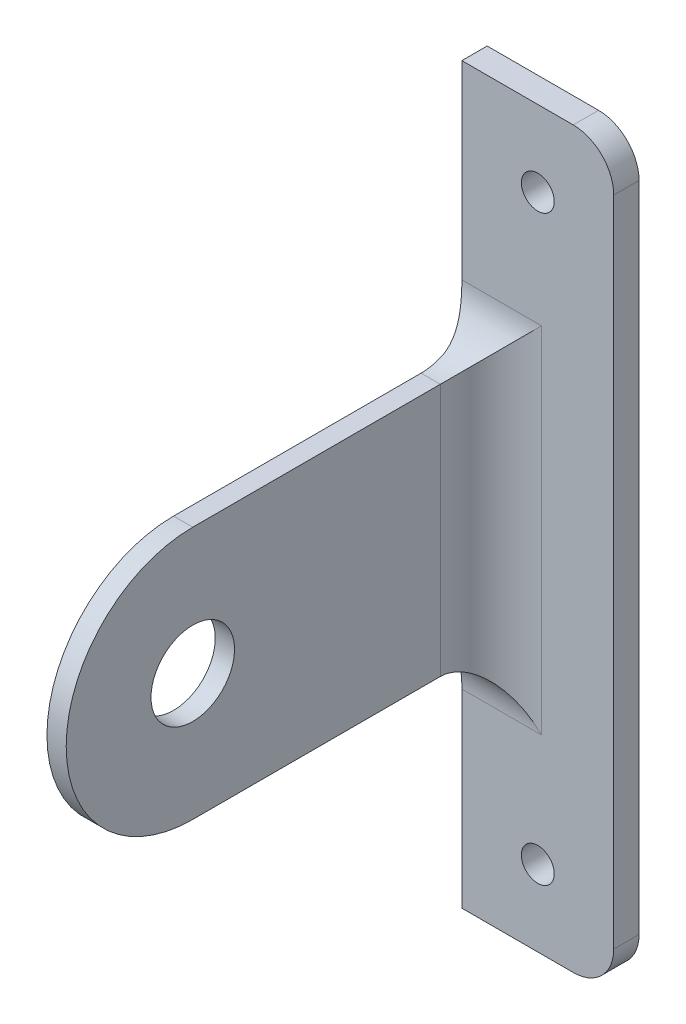
ISO-10303-21;
HEADER;
FILE_DESCRIPTION(('STEP AP214'),'2;1');
FILE_NAME('part.step','',(''),(''),'','','');
FILE_SCHEMA(('AUTOMOTIVE_DESIGN { 1 0 10303 214 1 1 1 1 }'));
ENDSEC;
DATA;
#1=APPLICATION_CONTEXT('core data for automotive mechanical design processes');
#2=APPLICATION_PROTOCOL_DEFINITION('international standard','automotive_design',2000,#1);
#3=PRODUCT_CONTEXT('',#1,'mechanical');
#4=PRODUCT('Part','Part','',(#3));
#5=PRODUCT_RELATED_PRODUCT_CATEGORY('part','',(#4));
#6=PRODUCT_DEFINITION_FORMATION('','',#4);
#7=PRODUCT_DEFINITION_CONTEXT('part definition',#1,'design');
#8=PRODUCT_DEFINITION('design','',#6,#7);
#9=PRODUCT_DEFINITION_SHAPE('','',#8);
#10=(LENGTH_UNIT() NAMED_UNIT(*) SI_UNIT(.MILLI.,.METRE.));
#11=(NAMED_UNIT(*) PLANE_ANGLE_UNIT() SI_UNIT($,.RADIAN.));
#12=(NAMED_UNIT(*) SI_UNIT($,.STERADIAN.) SOLID_ANGLE_UNIT());
#13=UNCERTAINTY_MEASURE_WITH_UNIT(LENGTH_MEASURE(1.E-05),#10,'distance_accuracy_value','');
#14=(GEOMETRIC_REPRESENTATION_CONTEXT(3) GLOBAL_UNCERTAINTY_ASSIGNED_CONTEXT((#13)) GLOBAL_UNIT_ASSIGNED_CONTEXT((#10,
#11,#12)) REPRESENTATION_CONTEXT('',''));
#15=CARTESIAN_POINT('',(0.,0.,0.));
#16=DIRECTION('',(0.,0.,1.));
#17=DIRECTION('',(1.,0.,0.));
#18=AXIS2_PLACEMENT_3D('',#15,#16,#17);
#19=CARTESIAN_POINT('',(0.,-12.5,0.));
#20=DIRECTION('',(0.,1.,0.));
#21=DIRECTION('',(0.,0.,1.));
#22=AXIS2_PLACEMENT_3D('',#19,#20,#21);
#23=PLANE('',#22);
#24=DIRECTION('',(0.,0.,1.));
#25=VECTOR('',#24,1.);
#26=CARTESIAN_POINT('',(0.,-12.5,-4.125));
#27=LINE('',#26,#25);
#28=CARTESIAN_POINT('',(0.,-12.5,-24.45));
#29=VERTEX_POINT('',#28);
#30=CARTESIAN_POINT('',(0.,-12.5,0.));
#31=VERTEX_POINT('',#30);
#32=EDGE_CURVE('E247',#29,#31,#27,.T.);
#33=ORIENTED_EDGE('',*,*,#32,.F.);
#34=DIRECTION('',(-1.,0.,0.));
#35=VECTOR('',#34,1.);
#36=CARTESIAN_POINT('',(1.90000000000001,-12.5,-24.45));
#37=LINE('',#36,#35);
#38=CARTESIAN_POINT('',(1.9,-12.5,-24.45));
#39=VERTEX_POINT('',#38);
#40=EDGE_CURVE('E265',#29,#39,#37,.F.);
#41=ORIENTED_EDGE('',*,*,#40,.T.);
#42=DIRECTION('',(0.,0.,-1.));
#43=VECTOR('',#42,1.);
#44=CARTESIAN_POINT('',(1.9,-12.5,-4.125));
#45=LINE('',#44,#43);
#46=CARTESIAN_POINT('',(1.9,-12.5,0.));
#47=VERTEX_POINT('',#46);
#48=EDGE_CURVE('E231',#47,#39,#45,.T.);
#49=ORIENTED_EDGE('',*,*,#48,.F.);
#50=DIRECTION('',(-1.,0.,0.));
#51=VECTOR('',#50,1.);
#52=CARTESIAN_POINT('',(1.9,-12.5,0.));
#53=LINE('',#52,#51);
#54=EDGE_CURVE('E218',#47,#31,#53,.T.);
#55=ORIENTED_EDGE('',*,*,#54,.T.);
#56=EDGE_LOOP('',(#33,#41,#49,#55));
#57=FACE_BOUND('',#56,.T.);
#58=ADVANCED_FACE('F43',(#57),#23,.F.);
#59=CARTESIAN_POINT('',(0.,12.5,0.));
#60=DIRECTION('',(0.,1.,0.));
#61=DIRECTION('',(0.,0.,1.));
#62=AXIS2_PLACEMENT_3D('',#59,#60,#61);
#63=PLANE('',#62);
#64=DIRECTION('',(0.,0.,-1.));
#65=VECTOR('',#64,1.);
#66=CARTESIAN_POINT('',(1.9,12.5,-4.125));
#67=LINE('',#66,#65);
#68=CARTESIAN_POINT('',(1.9,12.5,0.));
#69=VERTEX_POINT('',#68);
#70=CARTESIAN_POINT('',(1.9,12.5,-24.45));
#71=VERTEX_POINT('',#70);
#72=EDGE_CURVE('E242',#69,#71,#67,.T.);
#73=ORIENTED_EDGE('',*,*,#72,.T.);
#74=DIRECTION('',(-1.,0.,0.));
#75=VECTOR('',#74,1.);
#76=CARTESIAN_POINT('',(0.,12.5,-24.45));
#77=LINE('',#76,#75);
#78=CARTESIAN_POINT('',(0.,12.5,-24.45));
#79=VERTEX_POINT('',#78);
#80=EDGE_CURVE('E272',#71,#79,#77,.T.);
#81=ORIENTED_EDGE('',*,*,#80,.T.);
#82=DIRECTION('',(0.,0.,1.));
#83=VECTOR('',#82,1.);
#84=CARTESIAN_POINT('',(0.,12.5,-4.125));
#85=LINE('',#84,#83);
#86=CARTESIAN_POINT('',(0.,12.5,0.));
#87=VERTEX_POINT('',#86);
#88=EDGE_CURVE('E246',#79,#87,#85,.T.);
#89=ORIENTED_EDGE('',*,*,#88,.T.);
#90=DIRECTION('',(-1.,0.,0.));
#91=VECTOR('',#90,1.);
#92=CARTESIAN_POINT('',(1.9,12.5,0.));
#93=LINE('',#92,#91);
#94=EDGE_CURVE('E223',#69,#87,#93,.T.);
#95=ORIENTED_EDGE('',*,*,#94,.F.);
#96=EDGE_LOOP('',(#73,#81,#89,#95));
#97=FACE_BOUND('',#96,.T.);
#98=ADVANCED_FACE('F308',(#97),#63,.T.);
#99=CARTESIAN_POINT('',(1.9,12.5,-4.125));
#100=DIRECTION('',(-1.,0.,0.));
#101=DIRECTION('',(0.,0.,1.));
#102=AXIS2_PLACEMENT_3D('',#99,#100,#101);
#103=PLANE('',#102);
#104=CARTESIAN_POINT('',(1.9,0.,0.));
#105=DIRECTION('',(1.,0.,0.));
#106=DIRECTION('',(0.,0.,-1.));
#107=AXIS2_PLACEMENT_3D('',#104,#105,#106);
#108=CIRCLE('',#107,4.125);
#109=CARTESIAN_POINT('',(1.9,0.,4.125));
#110=VERTEX_POINT('',#109);
#111=EDGE_CURVE('E222',#110,#110,#108,.T.);
#112=ORIENTED_EDGE('',*,*,#111,.F.);
#113=EDGE_LOOP('',(#112));
#114=FACE_BOUND('',#113,.T.);
#115=ORIENTED_EDGE('',*,*,#48,.T.);
#116=DIRECTION('',(0.,-1.,0.));
#117=VECTOR('',#116,1.);
#118=CARTESIAN_POINT('',(1.9,12.5,-24.45));
#119=LINE('',#118,#117);
#120=EDGE_CURVE('E275',#39,#71,#119,.F.);
#121=ORIENTED_EDGE('',*,*,#120,.T.);
#122=ORIENTED_EDGE('',*,*,#72,.F.);
#123=CARTESIAN_POINT('',(1.9,0.,0.));
#124=DIRECTION('',(1.,0.,0.));
#125=DIRECTION('',(0.,0.,-1.));
#126=AXIS2_PLACEMENT_3D('',#123,#124,#125);
#127=CIRCLE('',#126,12.5);
#128=EDGE_CURVE('E232',#69,#47,#127,.T.);
#129=ORIENTED_EDGE('',*,*,#128,.T.);
#130=EDGE_LOOP('',(#115,#121,#122,#129));
#131=FACE_BOUND('',#130,.T.);
#132=ADVANCED_FACE('F298',(#114,#131),#103,.F.);
#133=CARTESIAN_POINT('',(0.,12.5,-4.125));
#134=DIRECTION('',(1.,0.,0.));
#135=DIRECTION('',(0.,0.,-1.));
#136=AXIS2_PLACEMENT_3D('',#133,#134,#135);
#137=PLANE('',#136);
#138=CARTESIAN_POINT('',(0.,0.,0.));
#139=DIRECTION('',(1.,0.,0.));
#140=DIRECTION('',(0.,0.,-1.));
#141=AXIS2_PLACEMENT_3D('',#138,#139,#140);
#142=CIRCLE('',#141,4.125);
#143=CARTESIAN_POINT('',(0.,0.,4.125));
#144=VERTEX_POINT('',#143);
#145=EDGE_CURVE('E227',#144,#144,#142,.T.);
#146=ORIENTED_EDGE('',*,*,#145,.T.);
#147=EDGE_LOOP('',(#146));
#148=FACE_BOUND('',#147,.T.);
#149=ORIENTED_EDGE('',*,*,#88,.F.);
#150=CARTESIAN_POINT('',(0.,17.5,-24.45));
#151=DIRECTION('',(1.,0.,0.));
#152=DIRECTION('',(0.,0.,-1.));
#153=AXIS2_PLACEMENT_3D('',#150,#151,#152);
#154=CIRCLE('',#153,5.);
#155=CARTESIAN_POINT('',(0.,12.9352791185284,-26.4904223274257));
#156=VERTEX_POINT('',#155);
#157=EDGE_CURVE('E11',#79,#156,#154,.T.);
#158=ORIENTED_EDGE('',*,*,#157,.T.);
#159=CARTESIAN_POINT('',(0.,12.9352791185284,-26.4904223274257));
#160=CARTESIAN_POINT('',(0.,12.5,-26.4904223274257));
#161=B_SPLINE_CURVE_WITH_KNOTS('',1,(#159,#160),.UNSPECIFIED.,.F.,.F.,(2,2),(0.,1.),.UNSPECIFIED.);
#162=CARTESIAN_POINT('',(0.,12.5,-26.4904223274257));
#163=VERTEX_POINT('',#162);
#164=EDGE_CURVE('E281',#156,#163,#161,.T.);
#165=ORIENTED_EDGE('',*,*,#164,.T.);
#166=DIRECTION('',(0.,-1.,0.));
#167=VECTOR('',#166,1.);
#168=CARTESIAN_POINT('',(0.,12.5,-26.4904223274257));
#169=LINE('',#168,#167);
#170=CARTESIAN_POINT('',(0.,-12.5,-26.4904223274257));
#171=VERTEX_POINT('',#170);
#172=EDGE_CURVE('E269',#163,#171,#169,.T.);
#173=ORIENTED_EDGE('',*,*,#172,.T.);
#174=CARTESIAN_POINT('',(0.,-12.5,-26.4904223274257));
#175=CARTESIAN_POINT('',(0.,-12.9352791185284,-26.4904223274257));
#176=B_SPLINE_CURVE_WITH_KNOTS('',1,(#174,#175),.UNSPECIFIED.,.F.,.F.,(2,2),(0.,1.),.UNSPECIFIED.);
#177=CARTESIAN_POINT('',(0.,-12.9352791185284,-26.4904223274257));
#178=VERTEX_POINT('',#177);
#179=EDGE_CURVE('E53',#171,#178,#176,.T.);
#180=ORIENTED_EDGE('',*,*,#179,.T.);
#181=CARTESIAN_POINT('',(0.,-17.5,-24.45));
#182=DIRECTION('',(1.,0.,0.));
#183=DIRECTION('',(0.,0.,-1.));
#184=AXIS2_PLACEMENT_3D('',#181,#182,#183);
#185=CIRCLE('',#184,5.);
#186=EDGE_CURVE('E278',#178,#29,#185,.T.);
#187=ORIENTED_EDGE('',*,*,#186,.T.);
#188=ORIENTED_EDGE('',*,*,#32,.T.);
#189=CARTESIAN_POINT('',(0.,0.,0.));
#190=DIRECTION('',(1.,0.,0.));
#191=DIRECTION('',(0.,0.,-1.));
#192=AXIS2_PLACEMENT_3D('',#189,#190,#191);
#193=CIRCLE('',#192,12.5);
#194=EDGE_CURVE('E217',#87,#31,#193,.T.);
#195=ORIENTED_EDGE('',*,*,#194,.F.);
#196=EDGE_LOOP('',(#149,#158,#165,#173,#180,#187,#188,#195));
#197=FACE_BOUND('',#196,.T.);
#198=ADVANCED_FACE('F287',(#148,#197),#137,.F.);
#199=CARTESIAN_POINT('',(1.9,12.5,-31.95));
#200=DIRECTION('',(0.,0.,1.));
#201=DIRECTION('',(1.,0.,0.));
#202=AXIS2_PLACEMENT_3D('',#199,#200,#201);
#203=PLANE('',#202);
#204=CARTESIAN_POINT('',(6.53,-28.75,-31.95));
#205=DIRECTION('',(0.,0.,1.));
#206=DIRECTION('',(-1.,0.,0.));
#207=AXIS2_PLACEMENT_3D('',#204,#205,#206);
#208=CIRCLE('',#207,1.625);
#209=CARTESIAN_POINT('',(4.905,-28.75,-31.95));
#210=VERTEX_POINT('',#209);
#211=EDGE_CURVE('E395',#210,#210,#208,.T.);
#212=ORIENTED_EDGE('',*,*,#211,.T.);
#213=EDGE_LOOP('',(#212));
#214=FACE_BOUND('',#213,.T.);
#215=CARTESIAN_POINT('',(6.53,28.75,-31.95));
#216=DIRECTION('',(0.,0.,-1.));
#217=DIRECTION('',(-1.,0.,0.));
#218=AXIS2_PLACEMENT_3D('',#215,#216,#217);
#219=CIRCLE('',#218,1.625);
#220=CARTESIAN_POINT('',(4.905,28.75,-31.95));
#221=VERTEX_POINT('',#220);
#222=EDGE_CURVE('E387',#221,#221,#219,.T.);
#223=ORIENTED_EDGE('',*,*,#222,.F.);
#224=EDGE_LOOP('',(#223));
#225=FACE_BOUND('',#224,.T.);
#226=DIRECTION('',(0.,-1.,0.));
#227=VECTOR('',#226,1.);
#228=CARTESIAN_POINT('',(14.03,12.5,-31.95));
#229=LINE('',#228,#227);
#230=CARTESIAN_POINT('',(14.03,32.25,-31.95));
#231=VERTEX_POINT('',#230);
#232=CARTESIAN_POINT('',(14.03,-32.25,-31.95));
#233=VERTEX_POINT('',#232);
#234=EDGE_CURVE('E214',#231,#233,#229,.T.);
#235=ORIENTED_EDGE('',*,*,#234,.T.);
#236=CARTESIAN_POINT('',(10.03,-32.25,-31.95));
#237=DIRECTION('',(0.,0.,1.));
#238=DIRECTION('',(-1.,0.,0.));
#239=AXIS2_PLACEMENT_3D('',#236,#237,#238);
#240=CIRCLE('',#239,4.);
#241=CARTESIAN_POINT('',(10.03,-36.25,-31.95));
#242=VERTEX_POINT('',#241);
#243=EDGE_CURVE('E171',#242,#233,#240,.T.);
#244=ORIENTED_EDGE('',*,*,#243,.F.);
#245=DIRECTION('',(1.,0.,0.));
#246=VECTOR('',#245,1.);
#247=CARTESIAN_POINT('',(-0.97,-36.25,-31.95));
#248=LINE('',#247,#246);
#249=CARTESIAN_POINT('',(-0.97,-36.25,-31.95));
#250=VERTEX_POINT('',#249);
#251=EDGE_CURVE('E166',#250,#242,#248,.T.);
#252=ORIENTED_EDGE('',*,*,#251,.F.);
#253=DIRECTION('',(0.,-1.,0.));
#254=VECTOR('',#253,1.);
#255=CARTESIAN_POINT('',(-0.97,12.5,-31.95));
#256=LINE('',#255,#254);
#257=CARTESIAN_POINT('',(-0.97,36.25,-31.95));
#258=VERTEX_POINT('',#257);
#259=EDGE_CURVE('E210',#258,#250,#256,.T.);
#260=ORIENTED_EDGE('',*,*,#259,.F.);
#261=DIRECTION('',(1.,0.,0.));
#262=VECTOR('',#261,1.);
#263=CARTESIAN_POINT('',(-0.97,36.25,-31.95));
#264=LINE('',#263,#262);
#265=CARTESIAN_POINT('',(10.03,36.25,-31.95));
#266=VERTEX_POINT('',#265);
#267=EDGE_CURVE('E191',#258,#266,#264,.T.);
#268=ORIENTED_EDGE('',*,*,#267,.T.);
#269=CARTESIAN_POINT('',(10.03,32.25,-31.95));
#270=DIRECTION('',(0.,0.,-1.));
#271=DIRECTION('',(-1.,0.,0.));
#272=AXIS2_PLACEMENT_3D('',#269,#270,#271);
#273=CIRCLE('',#272,4.);
#274=EDGE_CURVE('E187',#266,#231,#273,.T.);
#275=ORIENTED_EDGE('',*,*,#274,.T.);
#276=EDGE_LOOP('',(#235,#244,#252,#260,#268,#275));
#277=FACE_BOUND('',#276,.T.);
#278=ADVANCED_FACE('F297',(#214,#225,#277),#203,.F.);
#279=CARTESIAN_POINT('',(1.9,0.,0.));
#280=DIRECTION('',(-1.,0.,0.));
#281=DIRECTION('',(0.,0.,1.));
#282=AXIS2_PLACEMENT_3D('',#279,#280,#281);
#283=CYLINDRICAL_SURFACE('',#282,12.5);
#284=ORIENTED_EDGE('',*,*,#194,.T.);
#285=ORIENTED_EDGE('',*,*,#54,.F.);
#286=ORIENTED_EDGE('',*,*,#128,.F.);
#287=ORIENTED_EDGE('',*,*,#94,.T.);
#288=EDGE_LOOP('',(#284,#285,#286,#287));
#289=FACE_BOUND('',#288,.T.);
#290=ADVANCED_FACE('F304',(#289),#283,.T.);
#291=CARTESIAN_POINT('',(1.9,0.,0.));
#292=DIRECTION('',(-1.,0.,0.));
#293=DIRECTION('',(0.,0.,1.));
#294=AXIS2_PLACEMENT_3D('',#291,#292,#293);
#295=CYLINDRICAL_SURFACE('',#294,4.125);
#296=CARTESIAN_POINT('',(1.9,0.,4.125));
#297=CARTESIAN_POINT('',(1.88020833333333,0.,4.125));
#298=CARTESIAN_POINT('',(1.86041666666667,0.,4.125));
#299=CARTESIAN_POINT('',(1.82083333333333,0.,4.125));
#300=CARTESIAN_POINT('',(1.80104166666667,0.,4.125));
#301=CARTESIAN_POINT('',(1.76145833333333,0.,4.125));
#302=CARTESIAN_POINT('',(1.74166666666667,0.,4.125));
#303=CARTESIAN_POINT('',(1.70208333333333,0.,4.125));
#304=CARTESIAN_POINT('',(1.68229166666667,0.,4.125));
#305=CARTESIAN_POINT('',(1.64270833333333,0.,4.125));
#306=CARTESIAN_POINT('',(1.62291666666667,0.,4.125));
#307=CARTESIAN_POINT('',(1.58333333333333,0.,4.125));
#308=CARTESIAN_POINT('',(1.56354166666667,0.,4.125));
#309=CARTESIAN_POINT('',(1.52395833333333,0.,4.125));
#310=CARTESIAN_POINT('',(1.50416666666667,0.,4.125));
#311=CARTESIAN_POINT('',(1.46458333333333,0.,4.125));
#312=CARTESIAN_POINT('',(1.44479166666667,0.,4.125));
#313=CARTESIAN_POINT('',(1.40520833333333,0.,4.125));
#314=CARTESIAN_POINT('',(1.38541666666667,0.,4.125));
#315=CARTESIAN_POINT('',(1.34583333333333,0.,4.125));
#316=CARTESIAN_POINT('',(1.32604166666667,0.,4.125));
#317=CARTESIAN_POINT('',(1.28645833333333,0.,4.125));
#318=CARTESIAN_POINT('',(1.26666666666667,0.,4.125));
#319=CARTESIAN_POINT('',(1.22708333333333,0.,4.125));
#320=CARTESIAN_POINT('',(1.20729166666667,0.,4.125));
#321=CARTESIAN_POINT('',(1.16770833333333,0.,4.125));
#322=CARTESIAN_POINT('',(1.14791666666667,0.,4.125));
#323=CARTESIAN_POINT('',(1.10833333333333,0.,4.125));
#324=CARTESIAN_POINT('',(1.08854166666667,0.,4.125));
#325=CARTESIAN_POINT('',(1.04895833333333,0.,4.125));
#326=CARTESIAN_POINT('',(1.02916666666667,0.,4.125));
#327=CARTESIAN_POINT('',(0.989583333333333,0.,4.125));
#328=CARTESIAN_POINT('',(0.969791666666667,0.,4.125));
#329=CARTESIAN_POINT('',(0.930208333333333,0.,4.125));
#330=CARTESIAN_POINT('',(0.910416666666667,0.,4.125));
#331=CARTESIAN_POINT('',(0.870833333333333,0.,4.125));
#332=CARTESIAN_POINT('',(0.851041666666667,0.,4.125));
#333=CARTESIAN_POINT('',(0.811458333333333,0.,4.125));
#334=CARTESIAN_POINT('',(0.791666666666667,0.,4.125));
#335=CARTESIAN_POINT('',(0.752083333333333,0.,4.125));
#336=CARTESIAN_POINT('',(0.732291666666667,0.,4.125));
#337=CARTESIAN_POINT('',(0.692708333333333,0.,4.125));
#338=CARTESIAN_POINT('',(0.672916666666667,0.,4.125));
#339=CARTESIAN_POINT('',(0.633333333333333,0.,4.125));
#340=CARTESIAN_POINT('',(0.613541666666667,0.,4.125));
#341=CARTESIAN_POINT('',(0.573958333333333,0.,4.125));
#342=CARTESIAN_POINT('',(0.554166666666667,0.,4.125));
#343=CARTESIAN_POINT('',(0.514583333333333,0.,4.125));
#344=CARTESIAN_POINT('',(0.494791666666667,0.,4.125));
#345=CARTESIAN_POINT('',(0.455208333333333,0.,4.125));
#346=CARTESIAN_POINT('',(0.435416666666667,0.,4.125));
#347=CARTESIAN_POINT('',(0.395833333333333,0.,4.125));
#348=CARTESIAN_POINT('',(0.376041666666667,0.,4.125));
#349=CARTESIAN_POINT('',(0.336458333333333,0.,4.125));
#350=CARTESIAN_POINT('',(0.316666666666667,0.,4.125));
#351=CARTESIAN_POINT('',(0.277083333333333,0.,4.125));
#352=CARTESIAN_POINT('',(0.257291666666667,0.,4.125));
#353=CARTESIAN_POINT('',(0.217708333333333,0.,4.125));
#354=CARTESIAN_POINT('',(0.197916666666667,0.,4.125));
#355=CARTESIAN_POINT('',(0.158333333333333,0.,4.125));
#356=CARTESIAN_POINT('',(0.138541666666667,0.,4.125));
#357=CARTESIAN_POINT('',(0.0989583333333333,0.,4.125));
#358=CARTESIAN_POINT('',(0.0791666666666666,0.,4.125));
#359=CARTESIAN_POINT('',(0.0395833333333333,0.,4.125));
#360=CARTESIAN_POINT('',(0.0197916666666666,0.,4.125));
#361=CARTESIAN_POINT('',(0.,0.,4.125));
#362=B_SPLINE_CURVE_WITH_KNOTS('',3,(#296,#297,#298,#299,#300,#301,#302,#303,#304,#305,#306,
#307,#308,#309,#310,#311,#312,#313,#314,#315,#316,#317,#318,#319,#320,#321,#322,#323,#324,#325,
#326,#327,#328,#329,#330,#331,#332,#333,#334,#335,#336,#337,#338,#339,#340,#341,#342,#343,#344,
#345,#346,#347,#348,#349,#350,#351,#352,#353,#354,#355,#356,#357,#358,#359,#360,#361),
.UNSPECIFIED.,.F.,.F.,(4,2,2,2,2,2,2,2,2,2,2,2,2,2,2,2,2,2,2,2,2,2,2,2,2,2,2,2,2,2,2,2,4),(0.,
0.059375,0.11875,0.178125,0.2375,0.296875,0.35625,0.415625,0.475,0.534375,0.59375,0.653125,
0.7125,0.771875,0.83125,0.890625,0.95,1.009375,1.06875,1.128125,1.1875,1.246875,1.30625,
1.365625,1.425,1.484375,1.54375,1.603125,1.6625,1.721875,1.78125,1.840625,1.9),.UNSPECIFIED.);
#363=EDGE_CURVE('BSEAM440',#110,#144,#362,.T.);
#364=ORIENTED_EDGE('',*,*,#111,.T.);
#365=ORIENTED_EDGE('',*,*,#145,.F.);
#366=ORIENTED_EDGE('',*,*,#363,.T.);
#367=ORIENTED_EDGE('',*,*,#363,.F.);
#368=EDGE_LOOP('',(#364,#366,#365,#367));
#369=FACE_BOUND('',#368,.T.);
#370=ADVANCED_FACE('F440',(#369),#295,.F.);
#371=CARTESIAN_POINT('',(-0.97,12.5,-31.95));
#372=DIRECTION('',(1.,0.,0.));
#373=DIRECTION('',(0.,0.,-1.));
#374=AXIS2_PLACEMENT_3D('',#371,#372,#373);
#375=PLANE('',#374);
#376=ORIENTED_EDGE('',*,*,#259,.T.);
#377=DIRECTION('',(0.,0.,-1.));
#378=VECTOR('',#377,1.);
#379=CARTESIAN_POINT('',(-0.97,-36.25,-29.45));
#380=LINE('',#379,#378);
#381=CARTESIAN_POINT('',(-0.97,-36.25,-29.45));
#382=VERTEX_POINT('',#381);
#383=EDGE_CURVE('E177',#382,#250,#380,.T.);
#384=ORIENTED_EDGE('',*,*,#383,.F.);
#385=DIRECTION('',(0.,-1.,0.));
#386=VECTOR('',#385,1.);
#387=CARTESIAN_POINT('',(-0.97,12.5,-29.45));
#388=LINE('',#387,#386);
#389=CARTESIAN_POINT('',(-0.97,-17.5,-29.45));
#390=VERTEX_POINT('',#389);
#391=EDGE_CURVE('E155',#390,#382,#388,.T.);
#392=ORIENTED_EDGE('',*,*,#391,.F.);
#393=CARTESIAN_POINT('',(-0.97,17.5,-29.45));
#394=VERTEX_POINT('',#393);
#395=EDGE_CURVE('E211',#394,#390,#388,.T.);
#396=ORIENTED_EDGE('',*,*,#395,.F.);
#397=CARTESIAN_POINT('',(-0.97,36.25,-29.45));
#398=VERTEX_POINT('',#397);
#399=EDGE_CURVE('E206',#398,#394,#388,.T.);
#400=ORIENTED_EDGE('',*,*,#399,.F.);
#401=DIRECTION('',(0.,0.,-1.));
#402=VECTOR('',#401,1.);
#403=CARTESIAN_POINT('',(-0.97,36.25,-29.45));
#404=LINE('',#403,#402);
#405=EDGE_CURVE('E190',#398,#258,#404,.T.);
#406=ORIENTED_EDGE('',*,*,#405,.T.);
#407=EDGE_LOOP('',(#376,#384,#392,#396,#400,#406));
#408=FACE_BOUND('',#407,.T.);
#409=ADVANCED_FACE('F406',(#408),#375,.F.);
#410=CARTESIAN_POINT('',(14.03,12.5,-29.45));
#411=DIRECTION('',(0.,0.,-1.));
#412=DIRECTION('',(-1.,0.,0.));
#413=AXIS2_PLACEMENT_3D('',#410,#411,#412);
#414=PLANE('',#413);
#415=CARTESIAN_POINT('',(6.53,-28.75,-29.45));
#416=DIRECTION('',(0.,0.,1.));
#417=DIRECTION('',(-1.,0.,0.));
#418=AXIS2_PLACEMENT_3D('',#415,#416,#417);
#419=CIRCLE('',#418,1.625);
#420=CARTESIAN_POINT('',(4.905,-28.75,-29.45));
#421=VERTEX_POINT('',#420);
#422=EDGE_CURVE('E391',#421,#421,#419,.T.);
#423=ORIENTED_EDGE('',*,*,#422,.F.);
#424=EDGE_LOOP('',(#423));
#425=FACE_BOUND('',#424,.T.);
#426=CARTESIAN_POINT('',(6.53,28.75,-29.45));
#427=DIRECTION('',(0.,0.,-1.));
#428=DIRECTION('',(-1.,0.,0.));
#429=AXIS2_PLACEMENT_3D('',#426,#427,#428);
#430=CIRCLE('',#429,1.625);
#431=CARTESIAN_POINT('',(4.905,28.75,-29.45));
#432=VERTEX_POINT('',#431);
#433=EDGE_CURVE('E385',#432,#432,#430,.T.);
#434=ORIENTED_EDGE('',*,*,#433,.T.);
#435=EDGE_LOOP('',(#434));
#436=FACE_BOUND('',#435,.T.);
#437=DIRECTION('',(0.,-1.,0.));
#438=VECTOR('',#437,1.);
#439=CARTESIAN_POINT('',(6.9,-12.5,-29.45));
#440=LINE('',#439,#438);
#441=CARTESIAN_POINT('',(6.9,17.5,-29.45));
#442=VERTEX_POINT('',#441);
#443=CARTESIAN_POINT('',(6.9,-17.5,-29.45));
#444=VERTEX_POINT('',#443);
#445=EDGE_CURVE('E250',#442,#444,#440,.T.);
#446=ORIENTED_EDGE('',*,*,#445,.T.);
#447=DIRECTION('',(-1.,0.,0.));
#448=VECTOR('',#447,1.);
#449=CARTESIAN_POINT('',(0.,-17.5,-29.45));
#450=LINE('',#449,#448);
#451=EDGE_CURVE('E261',#444,#390,#450,.T.);
#452=ORIENTED_EDGE('',*,*,#451,.T.);
#453=ORIENTED_EDGE('',*,*,#391,.T.);
#454=DIRECTION('',(1.,0.,0.));
#455=VECTOR('',#454,1.);
#456=CARTESIAN_POINT('',(-0.97,-36.25,-29.45));
#457=LINE('',#456,#455);
#458=CARTESIAN_POINT('',(10.03,-36.25,-29.45));
#459=VERTEX_POINT('',#458);
#460=EDGE_CURVE('E161',#382,#459,#457,.T.);
#461=ORIENTED_EDGE('',*,*,#460,.T.);
#462=CARTESIAN_POINT('',(10.03,-32.25,-29.45));
#463=DIRECTION('',(0.,0.,1.));
#464=DIRECTION('',(-1.,0.,0.));
#465=AXIS2_PLACEMENT_3D('',#462,#463,#464);
#466=CIRCLE('',#465,4.);
#467=CARTESIAN_POINT('',(14.03,-32.25,-29.45));
#468=VERTEX_POINT('',#467);
#469=EDGE_CURVE('E158',#459,#468,#466,.T.);
#470=ORIENTED_EDGE('',*,*,#469,.T.);
#471=DIRECTION('',(0.,-1.,0.));
#472=VECTOR('',#471,1.);
#473=CARTESIAN_POINT('',(14.03,12.5,-29.45));
#474=LINE('',#473,#472);
#475=CARTESIAN_POINT('',(14.03,32.25,-29.45));
#476=VERTEX_POINT('',#475);
#477=EDGE_CURVE('E144',#476,#468,#474,.T.);
#478=ORIENTED_EDGE('',*,*,#477,.F.);
#479=CARTESIAN_POINT('',(10.03,32.25,-29.45));
#480=DIRECTION('',(0.,0.,-1.));
#481=DIRECTION('',(-1.,0.,0.));
#482=AXIS2_PLACEMENT_3D('',#479,#480,#481);
#483=CIRCLE('',#482,4.);
#484=CARTESIAN_POINT('',(10.03,36.25,-29.45));
#485=VERTEX_POINT('',#484);
#486=EDGE_CURVE('E186',#485,#476,#483,.T.);
#487=ORIENTED_EDGE('',*,*,#486,.F.);
#488=DIRECTION('',(1.,0.,0.));
#489=VECTOR('',#488,1.);
#490=CARTESIAN_POINT('',(-0.97,36.25,-29.45));
#491=LINE('',#490,#489);
#492=EDGE_CURVE('E182',#398,#485,#491,.T.);
#493=ORIENTED_EDGE('',*,*,#492,.F.);
#494=ORIENTED_EDGE('',*,*,#399,.T.);
#495=DIRECTION('',(-1.,0.,0.));
#496=VECTOR('',#495,1.);
#497=CARTESIAN_POINT('',(14.03,17.5,-29.45));
#498=LINE('',#497,#496);
#499=EDGE_CURVE('E258',#394,#442,#498,.F.);
#500=ORIENTED_EDGE('',*,*,#499,.T.);
#501=EDGE_LOOP('',(#446,#452,#453,#461,#470,#478,#487,#493,#494,#500));
#502=FACE_BOUND('',#501,.T.);
#503=ADVANCED_FACE('F159',(#425,#436,#502),#414,.F.);
#504=CARTESIAN_POINT('',(14.03,12.5,-31.95));
#505=DIRECTION('',(-1.,0.,0.));
#506=DIRECTION('',(0.,0.,1.));
#507=AXIS2_PLACEMENT_3D('',#504,#505,#506);
#508=PLANE('',#507);
#509=ORIENTED_EDGE('',*,*,#477,.T.);
#510=DIRECTION('',(0.,0.,-1.));
#511=VECTOR('',#510,1.);
#512=CARTESIAN_POINT('',(14.03,-32.25,-29.45));
#513=LINE('',#512,#511);
#514=EDGE_CURVE('E148',#468,#233,#513,.T.);
#515=ORIENTED_EDGE('',*,*,#514,.T.);
#516=ORIENTED_EDGE('',*,*,#234,.F.);
#517=DIRECTION('',(0.,0.,-1.));
#518=VECTOR('',#517,1.);
#519=CARTESIAN_POINT('',(14.03,32.25,-29.45));
#520=LINE('',#519,#518);
#521=EDGE_CURVE('E150',#476,#231,#520,.T.);
#522=ORIENTED_EDGE('',*,*,#521,.F.);
#523=EDGE_LOOP('',(#509,#515,#516,#522));
#524=FACE_BOUND('',#523,.T.);
#525=ADVANCED_FACE('F146',(#524),#508,.F.);
#526=CARTESIAN_POINT('',(10.03,32.25,-29.45));
#527=DIRECTION('',(0.,0.,-1.));
#528=DIRECTION('',(-1.,0.,0.));
#529=AXIS2_PLACEMENT_3D('',#526,#527,#528);
#530=CYLINDRICAL_SURFACE('',#529,4.);
#531=ORIENTED_EDGE('',*,*,#274,.F.);
#532=DIRECTION('',(0.,0.,-1.));
#533=VECTOR('',#532,1.);
#534=CARTESIAN_POINT('',(10.03,36.25,-29.45));
#535=LINE('',#534,#533);
#536=EDGE_CURVE('E200',#485,#266,#535,.T.);
#537=ORIENTED_EDGE('',*,*,#536,.F.);
#538=ORIENTED_EDGE('',*,*,#486,.T.);
#539=ORIENTED_EDGE('',*,*,#521,.T.);
#540=EDGE_LOOP('',(#531,#537,#538,#539));
#541=FACE_BOUND('',#540,.T.);
#542=ADVANCED_FACE('F418',(#541),#530,.T.);
#543=CARTESIAN_POINT('',(-0.97,36.25,-29.45));
#544=DIRECTION('',(0.,1.,0.));
#545=DIRECTION('',(0.,0.,1.));
#546=AXIS2_PLACEMENT_3D('',#543,#544,#545);
#547=PLANE('',#546);
#548=ORIENTED_EDGE('',*,*,#267,.F.);
#549=ORIENTED_EDGE('',*,*,#405,.F.);
#550=ORIENTED_EDGE('',*,*,#492,.T.);
#551=ORIENTED_EDGE('',*,*,#536,.T.);
#552=EDGE_LOOP('',(#548,#549,#550,#551));
#553=FACE_BOUND('',#552,.T.);
#554=ADVANCED_FACE('F423',(#553),#547,.T.);
#555=CARTESIAN_POINT('',(-0.97,-36.25,-29.45));
#556=DIRECTION('',(0.,1.,0.));
#557=DIRECTION('',(0.,0.,1.));
#558=AXIS2_PLACEMENT_3D('',#555,#556,#557);
#559=PLANE('',#558);
#560=ORIENTED_EDGE('',*,*,#251,.T.);
#561=DIRECTION('',(0.,0.,-1.));
#562=VECTOR('',#561,1.);
#563=CARTESIAN_POINT('',(10.03,-36.25,-29.45));
#564=LINE('',#563,#562);
#565=EDGE_CURVE('E173',#459,#242,#564,.T.);
#566=ORIENTED_EDGE('',*,*,#565,.F.);
#567=ORIENTED_EDGE('',*,*,#460,.F.);
#568=ORIENTED_EDGE('',*,*,#383,.T.);
#569=EDGE_LOOP('',(#560,#566,#567,#568));
#570=FACE_BOUND('',#569,.T.);
#571=ADVANCED_FACE('F426',(#570),#559,.F.);
#572=CARTESIAN_POINT('',(10.03,-32.25,-29.45));
#573=DIRECTION('',(0.,0.,-1.));
#574=DIRECTION('',(-1.,0.,0.));
#575=AXIS2_PLACEMENT_3D('',#572,#573,#574);
#576=CYLINDRICAL_SURFACE('',#575,4.);
#577=ORIENTED_EDGE('',*,*,#243,.T.);
#578=ORIENTED_EDGE('',*,*,#514,.F.);
#579=ORIENTED_EDGE('',*,*,#469,.F.);
#580=ORIENTED_EDGE('',*,*,#565,.T.);
#581=EDGE_LOOP('',(#577,#578,#579,#580));
#582=FACE_BOUND('',#581,.T.);
#583=ADVANCED_FACE('F169',(#582),#576,.T.);
#584=CARTESIAN_POINT('',(6.53,28.75,-29.45));
#585=DIRECTION('',(0.,0.,-1.));
#586=DIRECTION('',(-1.,0.,0.));
#587=AXIS2_PLACEMENT_3D('',#584,#585,#586);
#588=CYLINDRICAL_SURFACE('',#587,1.625);
#589=ORIENTED_EDGE('',*,*,#433,.F.);
#590=EDGE_LOOP('',(#589));
#591=FACE_BOUND('',#590,.T.);
#592=ORIENTED_EDGE('',*,*,#222,.T.);
#593=EDGE_LOOP('',(#592));
#594=FACE_BOUND('',#593,.T.);
#595=ADVANCED_FACE('F343',(#591,#594),#588,.F.);
#596=CARTESIAN_POINT('',(6.53,-28.75,-29.45));
#597=DIRECTION('',(0.,0.,-1.));
#598=DIRECTION('',(-1.,0.,0.));
#599=AXIS2_PLACEMENT_3D('',#596,#597,#598);
#600=CYLINDRICAL_SURFACE('',#599,1.625);
#601=ORIENTED_EDGE('',*,*,#422,.T.);
#602=EDGE_LOOP('',(#601));
#603=FACE_BOUND('',#602,.T.);
#604=ORIENTED_EDGE('',*,*,#211,.F.);
#605=EDGE_LOOP('',(#604));
#606=FACE_BOUND('',#605,.T.);
#607=ADVANCED_FACE('F336',(#603,#606),#600,.F.);
#608=CARTESIAN_POINT('',(0.,17.5,-24.45));
#609=DIRECTION('',(-1.,0.,0.));
#610=DIRECTION('',(0.,0.,1.));
#611=AXIS2_PLACEMENT_3D('',#608,#609,#610);
#612=CYLINDRICAL_SURFACE('',#611,5.);
#613=ORIENTED_EDGE('',*,*,#157,.F.);
#614=ORIENTED_EDGE('',*,*,#80,.F.);
#615=CARTESIAN_POINT('',(6.9,17.5,-24.45));
#616=DIRECTION('',(-0.707106781186547,0.707106781186547,0.));
#617=DIRECTION('',(0.707106781186547,0.707106781186547,0.));
#618=AXIS2_PLACEMENT_3D('',#615,#616,#617);
#619=ELLIPSE('',#618,7.07106781186547,5.);
#620=EDGE_CURVE('E47',#442,#71,#619,.T.);
#621=ORIENTED_EDGE('',*,*,#620,.F.);
#622=ORIENTED_EDGE('',*,*,#499,.F.);
#623=CARTESIAN_POINT('',(-0.97,17.5,-29.45));
#624=CARTESIAN_POINT('',(-0.970079899164056,17.3701049038207,-29.4500301365659));
#625=CARTESIAN_POINT('',(-0.966284576796977,17.2402500129345,-29.444939803141));
#626=CARTESIAN_POINT('',(-0.951551204793543,16.9818840424503,-29.4247605335802));
#627=CARTESIAN_POINT('',(-0.940622043722495,16.8533714925146,-29.409684039579));
#628=CARTESIAN_POINT('',(-0.912352046299374,16.5997565240031,-29.3699509679432));
#629=CARTESIAN_POINT('',(-0.895069028094303,16.4746339537154,-29.3453806810961));
#630=CARTESIAN_POINT('',(-0.855082497576353,16.2274269727635,-29.2870124477417));
#631=CARTESIAN_POINT('',(-0.832377482086573,16.105343415008,-29.2532119419049));
#632=CARTESIAN_POINT('',(-0.782816880609937,15.8654559815642,-29.1769477642139));
#633=CARTESIAN_POINT('',(-0.755981566245618,15.747634500377,-29.1345260958268));
#634=CARTESIAN_POINT('',(-0.699294757293463,15.516152033476,-29.0412870186986));
#635=CARTESIAN_POINT('',(-0.66944340943242,15.4024908457345,-28.9904700183051));
#636=CARTESIAN_POINT('',(-0.57696028922591,15.0675079823907,-28.8255122349336));
#637=CARTESIAN_POINT('',(-0.511559151953342,14.8528962193414,-28.6990922281402));
#638=CARTESIAN_POINT('',(-0.374301258983328,14.4173656935916,-28.3967087622663));
#639=CARTESIAN_POINT('',(-0.302726350453535,14.1993278789313,-28.2164166862097));
#640=CARTESIAN_POINT('',(-0.207238058290553,13.8961997256557,-27.9188054355513));
#641=CARTESIAN_POINT('',(-0.177418352421783,13.7992543282084,-27.8152232280683));
#642=CARTESIAN_POINT('',(-0.123261300433566,13.6139193241557,-27.5993808257014));
#643=CARTESIAN_POINT('',(-0.0989212666786567,13.5255255353961,-27.4871249214883));
#644=CARTESIAN_POINT('',(-0.0537066998880335,13.3435807966599,-27.234315876693));
#645=CARTESIAN_POINT('',(-0.0341646858240219,13.2517928573734,-27.092231038347));
#646=CARTESIAN_POINT('',(-0.0140201579687512,13.1248539090104,-26.8718450740968));
#647=CARTESIAN_POINT('',(-0.00883237271217802,13.0842682072443,-26.7970322882268));
#648=CARTESIAN_POINT('',(-0.00182011807073649,13.0068846804583,-26.6452626313622));
#649=CARTESIAN_POINT('',(2.25806700241875E-06,12.970089226354,-26.5683044561425));
#650=CARTESIAN_POINT('',(0.,12.9352791185284,-26.4904223274257));
#651=B_SPLINE_CURVE_WITH_KNOTS('',3,(#623,#624,#625,#626,#627,#628,#629,#630,#631,#632,#633,
#634,#635,#636,#637,#638,#639,#640,#641,#642,#643,#644,#645,#646,#647,#648,#649,#650),
.UNSPECIFIED.,.F.,.F.,(4,2,2,2,2,2,2,2,2,2,2,2,2,4),(0.,0.389466311164096,0.77844828202075,
1.16397487652975,1.54960847751762,1.93340642142806,2.31718570296248,3.08700618817996,
3.95804575551257,4.39245108998988,4.82664289359202,5.33611464761218,5.59177105585042,
5.84758642604938),.UNSPECIFIED.);
#652=EDGE_CURVE('E325',#156,#394,#651,.F.);
#653=ORIENTED_EDGE('',*,*,#652,.F.);
#654=EDGE_LOOP('',(#613,#614,#621,#622,#653));
#655=FACE_BOUND('',#654,.T.);
#656=ADVANCED_FACE('F333',(#655),#612,.F.);
#657=CARTESIAN_POINT('',(6.9,12.5,-24.45));
#658=DIRECTION('',(0.,1.,0.));
#659=DIRECTION('',(0.,0.,1.));
#660=AXIS2_PLACEMENT_3D('',#657,#658,#659);
#661=CYLINDRICAL_SURFACE('',#660,5.);
#662=ORIENTED_EDGE('',*,*,#620,.T.);
#663=ORIENTED_EDGE('',*,*,#120,.F.);
#664=CARTESIAN_POINT('',(6.9,-17.5,-24.45));
#665=DIRECTION('',(0.707106781186547,0.707106781186547,0.));
#666=DIRECTION('',(-0.707106781186547,0.707106781186547,0.));
#667=AXIS2_PLACEMENT_3D('',#664,#665,#666);
#668=ELLIPSE('',#667,7.07106781186547,5.);
#669=EDGE_CURVE('E332',#444,#39,#668,.T.);
#670=ORIENTED_EDGE('',*,*,#669,.F.);
#671=ORIENTED_EDGE('',*,*,#445,.F.);
#672=EDGE_LOOP('',(#662,#663,#670,#671));
#673=FACE_BOUND('',#672,.T.);
#674=ADVANCED_FACE('F45',(#673),#661,.F.);
#675=CARTESIAN_POINT('',(-5.,12.5,-26.4904223274257));
#676=DIRECTION('',(0.,-1.,0.));
#677=DIRECTION('',(0.,0.,-1.));
#678=AXIS2_PLACEMENT_3D('',#675,#676,#677);
#679=CYLINDRICAL_SURFACE('',#678,5.);
#680=ORIENTED_EDGE('',*,*,#652,.T.);
#681=ORIENTED_EDGE('',*,*,#395,.T.);
#682=CARTESIAN_POINT('',(-0.97,-17.5,-29.45));
#683=CARTESIAN_POINT('',(-0.970079899164056,-17.3701049038207,-29.4500301365659));
#684=CARTESIAN_POINT('',(-0.966284576796977,-17.2402500129345,-29.444939803141));
#685=CARTESIAN_POINT('',(-0.951551204793543,-16.9818840424503,-29.4247605335802));
#686=CARTESIAN_POINT('',(-0.940622043722495,-16.8533714925146,-29.409684039579));
#687=CARTESIAN_POINT('',(-0.912352046299374,-16.5997565240031,-29.3699509679432));
#688=CARTESIAN_POINT('',(-0.895069028094303,-16.4746339537154,-29.3453806810961));
#689=CARTESIAN_POINT('',(-0.855082497576353,-16.2274269727635,-29.2870124477417));
#690=CARTESIAN_POINT('',(-0.832377482086573,-16.105343415008,-29.2532119419049));
#691=CARTESIAN_POINT('',(-0.782816880609937,-15.8654559815642,-29.1769477642139));
#692=CARTESIAN_POINT('',(-0.755981566245618,-15.747634500377,-29.1345260958268));
#693=CARTESIAN_POINT('',(-0.699294757293463,-15.516152033476,-29.0412870186986));
#694=CARTESIAN_POINT('',(-0.66944340943242,-15.4024908457345,-28.9904700183051));
#695=CARTESIAN_POINT('',(-0.57696028922591,-15.0675079823907,-28.8255122349336));
#696=CARTESIAN_POINT('',(-0.511559151953341,-14.8528962193414,-28.6990922281402));
#697=CARTESIAN_POINT('',(-0.374301258983328,-14.4173656935916,-28.3967087622663));
#698=CARTESIAN_POINT('',(-0.302726350453535,-14.1993278789313,-28.2164166862097));
#699=CARTESIAN_POINT('',(-0.207238058290553,-13.8961997256557,-27.9188054355513));
#700=CARTESIAN_POINT('',(-0.177418352421783,-13.7992543282084,-27.8152232280683));
#701=CARTESIAN_POINT('',(-0.123261300433566,-13.6139193241557,-27.5993808257014));
#702=CARTESIAN_POINT('',(-0.0989212666786568,-13.5255255353961,-27.4871249214883));
#703=CARTESIAN_POINT('',(-0.0537066998880336,-13.3435807966599,-27.234315876693));
#704=CARTESIAN_POINT('',(-0.034164685824022,-13.2517928573734,-27.092231038347));
#705=CARTESIAN_POINT('',(-0.0140201579687513,-13.1248539090104,-26.8718450740968));
#706=CARTESIAN_POINT('',(-0.00883237271217809,-13.0842682072443,-26.7970322882268));
#707=CARTESIAN_POINT('',(-0.00182011807073658,-13.0068846804583,-26.6452626313622));
#708=CARTESIAN_POINT('',(2.25806700232282E-06,-12.970089226354,-26.5683044561425));
#709=CARTESIAN_POINT('',(0.,-12.9352791185284,-26.4904223274257));
#710=B_SPLINE_CURVE_WITH_KNOTS('',3,(#682,#683,#684,#685,#686,#687,#688,#689,#690,#691,#692,
#693,#694,#695,#696,#697,#698,#699,#700,#701,#702,#703,#704,#705,#706,#707,#708,#709),
.UNSPECIFIED.,.F.,.F.,(4,2,2,2,2,2,2,2,2,2,2,2,2,4),(0.,0.389466311164096,0.77844828202075,
1.16397487652975,1.54960847751762,1.93340642142806,2.31718570296248,3.08700618817996,
3.95804575551257,4.39245108998988,4.82664289359202,5.33611464761218,5.59177105585042,
5.84758642604938),.UNSPECIFIED.);
#711=EDGE_CURVE('E319',#178,#390,#710,.F.);
#712=ORIENTED_EDGE('',*,*,#711,.F.);
#713=ORIENTED_EDGE('',*,*,#179,.F.);
#714=ORIENTED_EDGE('',*,*,#172,.F.);
#715=ORIENTED_EDGE('',*,*,#164,.F.);
#716=EDGE_LOOP('',(#680,#681,#712,#713,#714,#715));
#717=FACE_BOUND('',#716,.T.);
#718=ADVANCED_FACE('F310',(#717),#679,.F.);
#719=CARTESIAN_POINT('',(14.03,-17.5,-24.45));
#720=DIRECTION('',(1.,0.,0.));
#721=DIRECTION('',(0.,0.,-1.));
#722=AXIS2_PLACEMENT_3D('',#719,#720,#721);
#723=CYLINDRICAL_SURFACE('',#722,5.);
#724=ORIENTED_EDGE('',*,*,#669,.T.);
#725=ORIENTED_EDGE('',*,*,#40,.F.);
#726=ORIENTED_EDGE('',*,*,#186,.F.);
#727=ORIENTED_EDGE('',*,*,#711,.T.);
#728=ORIENTED_EDGE('',*,*,#451,.F.);
#729=EDGE_LOOP('',(#724,#725,#726,#727,#728));
#730=FACE_BOUND('',#729,.T.);
#731=ADVANCED_FACE('F314',(#730),#723,.F.);
#732=CLOSED_SHELL('',(#58,#98,#132,#198,#278,#290,#370,#409,#503,#525,#542,#554,#571,#583,#595,
#607,#656,#674,#718,#731));
#733=MANIFOLD_SOLID_BREP('B2',#732);
#734=ADVANCED_BREP_SHAPE_REPRESENTATION('',(#18,#733),#14);
#735=SHAPE_DEFINITION_REPRESENTATION(#9,#734);
ENDSEC;
END-ISO-10303-21;
